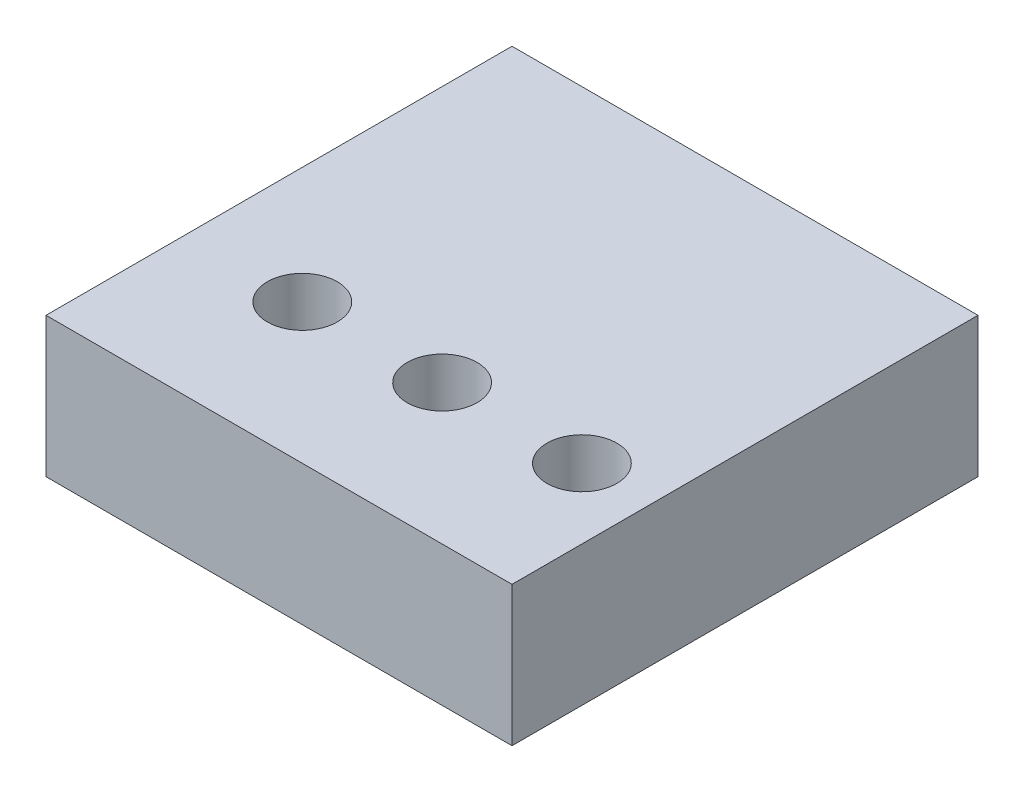
ISO-10303-21;
HEADER;
FILE_DESCRIPTION(('STEP AP214'),'2;1');
FILE_NAME('part.step','',(''),(''),'','','');
FILE_SCHEMA(('AUTOMOTIVE_DESIGN { 1 0 10303 214 1 1 1 1 }'));
ENDSEC;
DATA;
#1=APPLICATION_CONTEXT('core data for automotive mechanical design processes');
#2=APPLICATION_PROTOCOL_DEFINITION('international standard','automotive_design',2000,#1);
#3=PRODUCT_CONTEXT('',#1,'mechanical');
#4=PRODUCT('Part','Part','',(#3));
#5=PRODUCT_RELATED_PRODUCT_CATEGORY('part','',(#4));
#6=PRODUCT_DEFINITION_FORMATION('','',#4);
#7=PRODUCT_DEFINITION_CONTEXT('part definition',#1,'design');
#8=PRODUCT_DEFINITION('design','',#6,#7);
#9=PRODUCT_DEFINITION_SHAPE('','',#8);
#10=(LENGTH_UNIT() NAMED_UNIT(*) SI_UNIT(.MILLI.,.METRE.));
#11=(NAMED_UNIT(*) PLANE_ANGLE_UNIT() SI_UNIT($,.RADIAN.));
#12=(NAMED_UNIT(*) SI_UNIT($,.STERADIAN.) SOLID_ANGLE_UNIT());
#13=UNCERTAINTY_MEASURE_WITH_UNIT(LENGTH_MEASURE(1.E-05),#10,'distance_accuracy_value','');
#14=(GEOMETRIC_REPRESENTATION_CONTEXT(3) GLOBAL_UNCERTAINTY_ASSIGNED_CONTEXT((#13)) GLOBAL_UNIT_ASSIGNED_CONTEXT((#10,
#11,#12)) REPRESENTATION_CONTEXT('',''));
#15=CARTESIAN_POINT('',(0.,0.,0.));
#16=DIRECTION('',(0.,0.,1.));
#17=DIRECTION('',(1.,0.,0.));
#18=AXIS2_PLACEMENT_3D('',#15,#16,#17);
#19=CARTESIAN_POINT('',(0.,30.,0.));
#20=DIRECTION('',(1.,0.,0.));
#21=DIRECTION('',(0.,0.,-1.));
#22=AXIS2_PLACEMENT_3D('',#19,#20,#21);
#23=PLANE('',#22);
#24=DIRECTION('',(0.,0.,1.));
#25=VECTOR('',#24,1.);
#26=CARTESIAN_POINT('',(0.,0.,0.));
#27=LINE('',#26,#25);
#28=CARTESIAN_POINT('',(0.,0.,-100.));
#29=VERTEX_POINT('',#28);
#30=CARTESIAN_POINT('',(0.,0.,0.));
#31=VERTEX_POINT('',#30);
#32=EDGE_CURVE('E75',#29,#31,#27,.T.);
#33=ORIENTED_EDGE('',*,*,#32,.T.);
#34=DIRECTION('',(0.,-1.,0.));
#35=VECTOR('',#34,1.);
#36=CARTESIAN_POINT('',(0.,30.,0.));
#37=LINE('',#36,#35);
#38=CARTESIAN_POINT('',(0.,30.,0.));
#39=VERTEX_POINT('',#38);
#40=EDGE_CURVE('E11',#39,#31,#37,.T.);
#41=ORIENTED_EDGE('',*,*,#40,.F.);
#42=DIRECTION('',(0.,0.,1.));
#43=VECTOR('',#42,1.);
#44=CARTESIAN_POINT('',(0.,30.,0.));
#45=LINE('',#44,#43);
#46=CARTESIAN_POINT('',(0.,30.,-100.));
#47=VERTEX_POINT('',#46);
#48=EDGE_CURVE('E98',#47,#39,#45,.T.);
#49=ORIENTED_EDGE('',*,*,#48,.F.);
#50=DIRECTION('',(0.,-1.,0.));
#51=VECTOR('',#50,1.);
#52=CARTESIAN_POINT('',(0.,30.,-100.));
#53=LINE('',#52,#51);
#54=EDGE_CURVE('E87',#47,#29,#53,.T.);
#55=ORIENTED_EDGE('',*,*,#54,.T.);
#56=EDGE_LOOP('',(#33,#41,#49,#55));
#57=FACE_BOUND('',#56,.T.);
#58=ADVANCED_FACE('F31',(#57),#23,.F.);
#59=CARTESIAN_POINT('',(0.,30.,0.));
#60=DIRECTION('',(0.,0.,-1.));
#61=DIRECTION('',(-1.,0.,0.));
#62=AXIS2_PLACEMENT_3D('',#59,#60,#61);
#63=PLANE('',#62);
#64=DIRECTION('',(1.,0.,0.));
#65=VECTOR('',#64,1.);
#66=CARTESIAN_POINT('',(0.,0.,0.));
#67=LINE('',#66,#65);
#68=CARTESIAN_POINT('',(100.,0.,0.));
#69=VERTEX_POINT('',#68);
#70=EDGE_CURVE('E71',#31,#69,#67,.T.);
#71=ORIENTED_EDGE('',*,*,#70,.T.);
#72=DIRECTION('',(0.,-1.,0.));
#73=VECTOR('',#72,1.);
#74=CARTESIAN_POINT('',(100.,30.,0.));
#75=LINE('',#74,#73);
#76=CARTESIAN_POINT('',(100.,30.,0.));
#77=VERTEX_POINT('',#76);
#78=EDGE_CURVE('E38',#77,#69,#75,.T.);
#79=ORIENTED_EDGE('',*,*,#78,.F.);
#80=DIRECTION('',(1.,0.,0.));
#81=VECTOR('',#80,1.);
#82=CARTESIAN_POINT('',(0.,30.,0.));
#83=LINE('',#82,#81);
#84=EDGE_CURVE('E83',#39,#77,#83,.T.);
#85=ORIENTED_EDGE('',*,*,#84,.F.);
#86=ORIENTED_EDGE('',*,*,#40,.T.);
#87=EDGE_LOOP('',(#71,#79,#85,#86));
#88=FACE_BOUND('',#87,.T.);
#89=ADVANCED_FACE('F82',(#88),#63,.F.);
#90=CARTESIAN_POINT('',(100.,30.,0.));
#91=DIRECTION('',(-1.,0.,0.));
#92=DIRECTION('',(0.,0.,1.));
#93=AXIS2_PLACEMENT_3D('',#90,#91,#92);
#94=PLANE('',#93);
#95=DIRECTION('',(0.,0.,-1.));
#96=VECTOR('',#95,1.);
#97=CARTESIAN_POINT('',(100.,0.,0.));
#98=LINE('',#97,#96);
#99=CARTESIAN_POINT('',(100.,0.,-100.));
#100=VERTEX_POINT('',#99);
#101=EDGE_CURVE('E76',#69,#100,#98,.T.);
#102=ORIENTED_EDGE('',*,*,#101,.T.);
#103=DIRECTION('',(0.,-1.,0.));
#104=VECTOR('',#103,1.);
#105=CARTESIAN_POINT('',(100.,30.,-100.));
#106=LINE('',#105,#104);
#107=CARTESIAN_POINT('',(100.,30.,-100.));
#108=VERTEX_POINT('',#107);
#109=EDGE_CURVE('E104',#108,#100,#106,.T.);
#110=ORIENTED_EDGE('',*,*,#109,.F.);
#111=DIRECTION('',(0.,0.,-1.));
#112=VECTOR('',#111,1.);
#113=CARTESIAN_POINT('',(100.,30.,0.));
#114=LINE('',#113,#112);
#115=EDGE_CURVE('E50',#77,#108,#114,.T.);
#116=ORIENTED_EDGE('',*,*,#115,.F.);
#117=ORIENTED_EDGE('',*,*,#78,.T.);
#118=EDGE_LOOP('',(#102,#110,#116,#117));
#119=FACE_BOUND('',#118,.T.);
#120=ADVANCED_FACE('F107',(#119),#94,.F.);
#121=CARTESIAN_POINT('',(0.,30.,-100.));
#122=DIRECTION('',(0.,0.,1.));
#123=DIRECTION('',(1.,0.,0.));
#124=AXIS2_PLACEMENT_3D('',#121,#122,#123);
#125=PLANE('',#124);
#126=DIRECTION('',(-1.,0.,0.));
#127=VECTOR('',#126,1.);
#128=CARTESIAN_POINT('',(0.,0.,-100.));
#129=LINE('',#128,#127);
#130=EDGE_CURVE('E96',#100,#29,#129,.T.);
#131=ORIENTED_EDGE('',*,*,#130,.T.);
#132=ORIENTED_EDGE('',*,*,#54,.F.);
#133=DIRECTION('',(-1.,0.,0.));
#134=VECTOR('',#133,1.);
#135=CARTESIAN_POINT('',(0.,30.,-100.));
#136=LINE('',#135,#134);
#137=EDGE_CURVE('E45',#108,#47,#136,.T.);
#138=ORIENTED_EDGE('',*,*,#137,.F.);
#139=ORIENTED_EDGE('',*,*,#109,.T.);
#140=EDGE_LOOP('',(#131,#132,#138,#139));
#141=FACE_BOUND('',#140,.T.);
#142=ADVANCED_FACE('F109',(#141),#125,.F.);
#143=CARTESIAN_POINT('',(0.,30.,-100.));
#144=DIRECTION('',(0.,-1.,0.));
#145=DIRECTION('',(0.,0.,-1.));
#146=AXIS2_PLACEMENT_3D('',#143,#144,#145);
#147=PLANE('',#146);
#148=CARTESIAN_POINT('',(85.,30.,-30.));
#149=DIRECTION('',(0.,1.,0.));
#150=DIRECTION('',(0.,0.,1.));
#151=AXIS2_PLACEMENT_3D('',#148,#149,#150);
#152=CIRCLE('',#151,7.5);
#153=CARTESIAN_POINT('',(85.,30.,-22.5));
#154=VERTEX_POINT('',#153);
#155=EDGE_CURVE('E186',#154,#154,#152,.T.);
#156=ORIENTED_EDGE('',*,*,#155,.F.);
#157=EDGE_LOOP('',(#156));
#158=FACE_BOUND('',#157,.T.);
#159=CARTESIAN_POINT('',(25.,30.,-30.));
#160=DIRECTION('',(0.,1.,0.));
#161=DIRECTION('',(0.,0.,1.));
#162=AXIS2_PLACEMENT_3D('',#159,#160,#161);
#163=CIRCLE('',#162,7.5);
#164=CARTESIAN_POINT('',(25.,30.,-22.5));
#165=VERTEX_POINT('',#164);
#166=EDGE_CURVE('E188',#165,#165,#163,.T.);
#167=ORIENTED_EDGE('',*,*,#166,.F.);
#168=EDGE_LOOP('',(#167));
#169=FACE_BOUND('',#168,.T.);
#170=CARTESIAN_POINT('',(55.,30.,-30.));
#171=DIRECTION('',(0.,1.,0.));
#172=DIRECTION('',(0.,0.,1.));
#173=AXIS2_PLACEMENT_3D('',#170,#171,#172);
#174=CIRCLE('',#173,7.5);
#175=CARTESIAN_POINT('',(55.,30.,-22.5));
#176=VERTEX_POINT('',#175);
#177=EDGE_CURVE('E91',#176,#176,#174,.T.);
#178=ORIENTED_EDGE('',*,*,#177,.F.);
#179=EDGE_LOOP('',(#178));
#180=FACE_BOUND('',#179,.T.);
#181=ORIENTED_EDGE('',*,*,#48,.T.);
#182=ORIENTED_EDGE('',*,*,#84,.T.);
#183=ORIENTED_EDGE('',*,*,#115,.T.);
#184=ORIENTED_EDGE('',*,*,#137,.T.);
#185=EDGE_LOOP('',(#181,#182,#183,#184));
#186=FACE_BOUND('',#185,.T.);
#187=ADVANCED_FACE('F110',(#158,#169,#180,#186),#147,.F.);
#188=CARTESIAN_POINT('',(0.,0.,-100.));
#189=DIRECTION('',(0.,-1.,0.));
#190=DIRECTION('',(0.,0.,-1.));
#191=AXIS2_PLACEMENT_3D('',#188,#189,#190);
#192=PLANE('',#191);
#193=CARTESIAN_POINT('',(85.,0.,-30.));
#194=DIRECTION('',(0.,1.,0.));
#195=DIRECTION('',(0.,0.,1.));
#196=AXIS2_PLACEMENT_3D('',#193,#194,#195);
#197=CIRCLE('',#196,7.5);
#198=CARTESIAN_POINT('',(85.,0.,-22.5));
#199=VERTEX_POINT('',#198);
#200=EDGE_CURVE('E184',#199,#199,#197,.T.);
#201=ORIENTED_EDGE('',*,*,#200,.T.);
#202=EDGE_LOOP('',(#201));
#203=FACE_BOUND('',#202,.T.);
#204=CARTESIAN_POINT('',(25.,0.,-30.));
#205=DIRECTION('',(0.,1.,0.));
#206=DIRECTION('',(0.,0.,1.));
#207=AXIS2_PLACEMENT_3D('',#204,#205,#206);
#208=CIRCLE('',#207,7.5);
#209=CARTESIAN_POINT('',(25.,0.,-22.5));
#210=VERTEX_POINT('',#209);
#211=EDGE_CURVE('E193',#210,#210,#208,.T.);
#212=ORIENTED_EDGE('',*,*,#211,.T.);
#213=EDGE_LOOP('',(#212));
#214=FACE_BOUND('',#213,.T.);
#215=CARTESIAN_POINT('',(55.,0.,-30.));
#216=DIRECTION('',(0.,1.,0.));
#217=DIRECTION('',(0.,0.,1.));
#218=AXIS2_PLACEMENT_3D('',#215,#216,#217);
#219=CIRCLE('',#218,7.5);
#220=CARTESIAN_POINT('',(55.,0.,-22.5));
#221=VERTEX_POINT('',#220);
#222=EDGE_CURVE('E88',#221,#221,#219,.T.);
#223=ORIENTED_EDGE('',*,*,#222,.T.);
#224=EDGE_LOOP('',(#223));
#225=FACE_BOUND('',#224,.T.);
#226=ORIENTED_EDGE('',*,*,#32,.F.);
#227=ORIENTED_EDGE('',*,*,#130,.F.);
#228=ORIENTED_EDGE('',*,*,#101,.F.);
#229=ORIENTED_EDGE('',*,*,#70,.F.);
#230=EDGE_LOOP('',(#226,#227,#228,#229));
#231=FACE_BOUND('',#230,.T.);
#232=ADVANCED_FACE('F72',(#203,#214,#225,#231),#192,.T.);
#233=CARTESIAN_POINT('',(55.,0.,-30.));
#234=DIRECTION('',(0.,1.,0.));
#235=DIRECTION('',(0.,0.,1.));
#236=AXIS2_PLACEMENT_3D('',#233,#234,#235);
#237=CYLINDRICAL_SURFACE('',#236,7.5);
#238=ORIENTED_EDGE('',*,*,#222,.F.);
#239=EDGE_LOOP('',(#238));
#240=FACE_BOUND('',#239,.T.);
#241=ORIENTED_EDGE('',*,*,#177,.T.);
#242=EDGE_LOOP('',(#241));
#243=FACE_BOUND('',#242,.T.);
#244=ADVANCED_FACE('F118',(#240,#243),#237,.F.);
#245=CARTESIAN_POINT('',(25.,0.,-30.));
#246=DIRECTION('',(0.,1.,0.));
#247=DIRECTION('',(0.,0.,1.));
#248=AXIS2_PLACEMENT_3D('',#245,#246,#247);
#249=CYLINDRICAL_SURFACE('',#248,7.5);
#250=ORIENTED_EDGE('',*,*,#211,.F.);
#251=EDGE_LOOP('',(#250));
#252=FACE_BOUND('',#251,.T.);
#253=ORIENTED_EDGE('',*,*,#166,.T.);
#254=EDGE_LOOP('',(#253));
#255=FACE_BOUND('',#254,.T.);
#256=ADVANCED_FACE('F157',(#252,#255),#249,.F.);
#257=CARTESIAN_POINT('',(85.,0.,-30.));
#258=DIRECTION('',(0.,1.,0.));
#259=DIRECTION('',(0.,0.,1.));
#260=AXIS2_PLACEMENT_3D('',#257,#258,#259);
#261=CYLINDRICAL_SURFACE('',#260,7.5);
#262=ORIENTED_EDGE('',*,*,#200,.F.);
#263=EDGE_LOOP('',(#262));
#264=FACE_BOUND('',#263,.T.);
#265=ORIENTED_EDGE('',*,*,#155,.T.);
#266=EDGE_LOOP('',(#265));
#267=FACE_BOUND('',#266,.T.);
#268=ADVANCED_FACE('F167',(#264,#267),#261,.F.);
#269=CLOSED_SHELL('',(#58,#89,#120,#142,#187,#232,#244,#256,#268));
#270=MANIFOLD_SOLID_BREP('B2',#269);
#271=ADVANCED_BREP_SHAPE_REPRESENTATION('',(#18,#270),#14);
#272=SHAPE_DEFINITION_REPRESENTATION(#9,#271);
ENDSEC;
END-ISO-10303-21;
